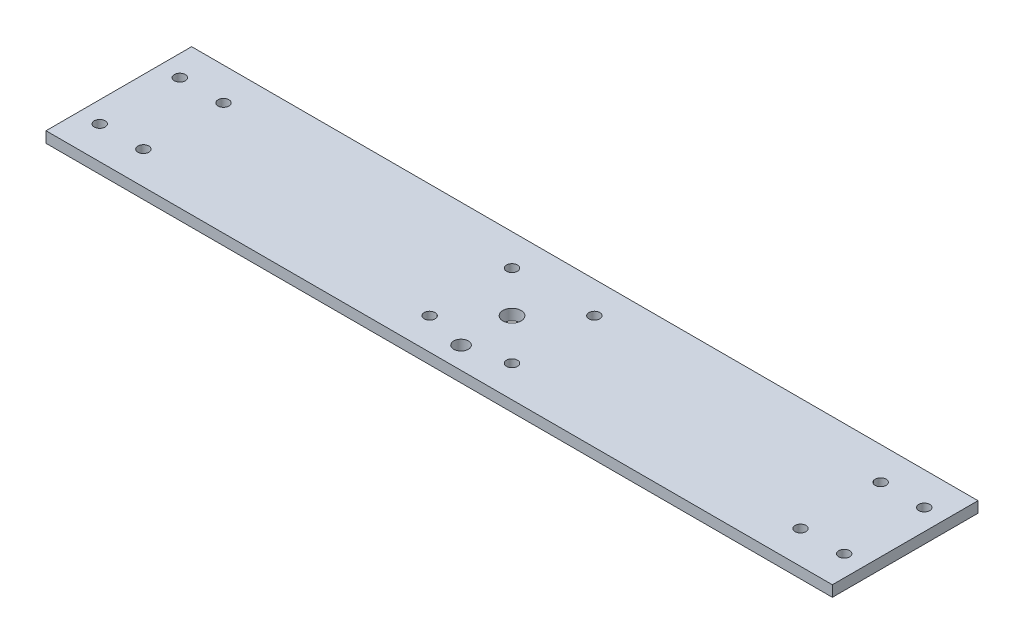
ISO-10303-21;
HEADER;
FILE_DESCRIPTION(('STEP AP214'),'2;1');
FILE_NAME('part.step','',(''),(''),'','','');
FILE_SCHEMA(('AUTOMOTIVE_DESIGN { 1 0 10303 214 1 1 1 1 }'));
ENDSEC;
DATA;
#1=APPLICATION_CONTEXT('core data for automotive mechanical design processes');
#2=APPLICATION_PROTOCOL_DEFINITION('international standard','automotive_design',2000,#1);
#3=PRODUCT_CONTEXT('',#1,'mechanical');
#4=PRODUCT('Part','Part','',(#3));
#5=PRODUCT_RELATED_PRODUCT_CATEGORY('part','',(#4));
#6=PRODUCT_DEFINITION_FORMATION('','',#4);
#7=PRODUCT_DEFINITION_CONTEXT('part definition',#1,'design');
#8=PRODUCT_DEFINITION('design','',#6,#7);
#9=PRODUCT_DEFINITION_SHAPE('','',#8);
#10=(LENGTH_UNIT() NAMED_UNIT(*) SI_UNIT(.MILLI.,.METRE.));
#11=(NAMED_UNIT(*) PLANE_ANGLE_UNIT() SI_UNIT($,.RADIAN.));
#12=(NAMED_UNIT(*) SI_UNIT($,.STERADIAN.) SOLID_ANGLE_UNIT());
#13=UNCERTAINTY_MEASURE_WITH_UNIT(LENGTH_MEASURE(1.E-05),#10,'distance_accuracy_value','');
#14=(GEOMETRIC_REPRESENTATION_CONTEXT(3) GLOBAL_UNCERTAINTY_ASSIGNED_CONTEXT((#13)) GLOBAL_UNIT_ASSIGNED_CONTEXT((#10,
#11,#12)) REPRESENTATION_CONTEXT('',''));
#15=CARTESIAN_POINT('',(0.,0.,0.));
#16=DIRECTION('',(0.,0.,1.));
#17=DIRECTION('',(1.,0.,0.));
#18=AXIS2_PLACEMENT_3D('',#15,#16,#17);
#19=CARTESIAN_POINT('',(0.,0.,0.));
#20=DIRECTION('',(0.,-1.,0.));
#21=DIRECTION('',(0.,0.,-1.));
#22=AXIS2_PLACEMENT_3D('',#19,#20,#21);
#23=PLANE('',#22);
#24=CARTESIAN_POINT('',(90.25,0.,11.));
#25=DIRECTION('',(0.,1.,0.));
#26=DIRECTION('',(0.,0.,1.));
#27=AXIS2_PLACEMENT_3D('',#24,#25,#26);
#28=CIRCLE('',#27,1.5);
#29=CARTESIAN_POINT('',(90.25,0.,12.5));
#30=VERTEX_POINT('',#29);
#31=EDGE_CURVE('E121',#30,#30,#28,.T.);
#32=ORIENTED_EDGE('',*,*,#31,.T.);
#33=EDGE_LOOP('',(#32));
#34=FACE_BOUND('',#33,.T.);
#35=CARTESIAN_POINT('',(90.25,0.,-11.));
#36=DIRECTION('',(0.,1.,0.));
#37=DIRECTION('',(0.,0.,1.));
#38=AXIS2_PLACEMENT_3D('',#35,#36,#37);
#39=CIRCLE('',#38,1.5);
#40=CARTESIAN_POINT('',(90.25,0.,-9.50000000000002));
#41=VERTEX_POINT('',#40);
#42=EDGE_CURVE('E127',#41,#41,#39,.T.);
#43=ORIENTED_EDGE('',*,*,#42,.T.);
#44=EDGE_LOOP('',(#43));
#45=FACE_BOUND('',#44,.T.);
#46=DIRECTION('',(0.,0.,-1.));
#47=VECTOR('',#46,1.);
#48=CARTESIAN_POINT('',(-108.,0.,20.));
#49=LINE('',#48,#47);
#50=CARTESIAN_POINT('',(-108.,0.,20.));
#51=VERTEX_POINT('',#50);
#52=CARTESIAN_POINT('',(-108.,0.,-20.));
#53=VERTEX_POINT('',#52);
#54=EDGE_CURVE('E56',#51,#53,#49,.T.);
#55=ORIENTED_EDGE('',*,*,#54,.T.);
#56=DIRECTION('',(1.,0.,0.));
#57=VECTOR('',#56,1.);
#58=CARTESIAN_POINT('',(-108.,0.,-20.));
#59=LINE('',#58,#57);
#60=CARTESIAN_POINT('',(108.,0.,-20.));
#61=VERTEX_POINT('',#60);
#62=EDGE_CURVE('E452',#53,#61,#59,.T.);
#63=ORIENTED_EDGE('',*,*,#62,.T.);
#64=DIRECTION('',(0.,0.,1.));
#65=VECTOR('',#64,1.);
#66=CARTESIAN_POINT('',(108.,0.,20.));
#67=LINE('',#66,#65);
#68=CARTESIAN_POINT('',(108.,0.,20.));
#69=VERTEX_POINT('',#68);
#70=EDGE_CURVE('E61',#61,#69,#67,.T.);
#71=ORIENTED_EDGE('',*,*,#70,.T.);
#72=DIRECTION('',(-1.,0.,0.));
#73=VECTOR('',#72,1.);
#74=CARTESIAN_POINT('',(-108.,0.,20.));
#75=LINE('',#74,#73);
#76=EDGE_CURVE('E59',#69,#51,#75,.T.);
#77=ORIENTED_EDGE('',*,*,#76,.T.);
#78=EDGE_LOOP('',(#55,#63,#71,#77));
#79=FACE_BOUND('',#78,.T.);
#80=CARTESIAN_POINT('',(-102.25,0.,-11.));
#81=DIRECTION('',(0.,1.,0.));
#82=DIRECTION('',(0.,0.,1.));
#83=AXIS2_PLACEMENT_3D('',#80,#81,#82);
#84=CIRCLE('',#83,1.5);
#85=CARTESIAN_POINT('',(-102.25,0.,-9.50000000000001));
#86=VERTEX_POINT('',#85);
#87=EDGE_CURVE('E67',#86,#86,#84,.T.);
#88=ORIENTED_EDGE('',*,*,#87,.T.);
#89=EDGE_LOOP('',(#88));
#90=FACE_BOUND('',#89,.T.);
#91=CARTESIAN_POINT('',(-90.25,0.,-11.));
#92=DIRECTION('',(0.,1.,0.));
#93=DIRECTION('',(0.,0.,1.));
#94=AXIS2_PLACEMENT_3D('',#91,#92,#93);
#95=CIRCLE('',#94,1.5);
#96=CARTESIAN_POINT('',(-90.25,0.,-9.50000000000002));
#97=VERTEX_POINT('',#96);
#98=EDGE_CURVE('E135',#97,#97,#95,.T.);
#99=ORIENTED_EDGE('',*,*,#98,.T.);
#100=EDGE_LOOP('',(#99));
#101=FACE_BOUND('',#100,.T.);
#102=CARTESIAN_POINT('',(-102.25,0.,11.));
#103=DIRECTION('',(0.,1.,0.));
#104=DIRECTION('',(0.,0.,1.));
#105=AXIS2_PLACEMENT_3D('',#102,#103,#104);
#106=CIRCLE('',#105,1.5);
#107=CARTESIAN_POINT('',(-102.25,0.,12.5));
#108=VERTEX_POINT('',#107);
#109=EDGE_CURVE('E138',#108,#108,#106,.T.);
#110=ORIENTED_EDGE('',*,*,#109,.T.);
#111=EDGE_LOOP('',(#110));
#112=FACE_BOUND('',#111,.T.);
#113=CARTESIAN_POINT('',(-90.25,0.,11.));
#114=DIRECTION('',(0.,1.,0.));
#115=DIRECTION('',(0.,0.,1.));
#116=AXIS2_PLACEMENT_3D('',#113,#114,#115);
#117=CIRCLE('',#116,1.5);
#118=CARTESIAN_POINT('',(-90.25,0.,12.5));
#119=VERTEX_POINT('',#118);
#120=EDGE_CURVE('E141',#119,#119,#117,.T.);
#121=ORIENTED_EDGE('',*,*,#120,.T.);
#122=EDGE_LOOP('',(#121));
#123=FACE_BOUND('',#122,.T.);
#124=CARTESIAN_POINT('',(102.25,0.,-11.));
#125=DIRECTION('',(0.,1.,0.));
#126=DIRECTION('',(0.,0.,1.));
#127=AXIS2_PLACEMENT_3D('',#124,#125,#126);
#128=CIRCLE('',#127,1.5);
#129=CARTESIAN_POINT('',(102.25,0.,-9.50000000000001));
#130=VERTEX_POINT('',#129);
#131=EDGE_CURVE('E130',#130,#130,#128,.T.);
#132=ORIENTED_EDGE('',*,*,#131,.T.);
#133=EDGE_LOOP('',(#132));
#134=FACE_BOUND('',#133,.T.);
#135=CARTESIAN_POINT('',(102.25,0.,11.));
#136=DIRECTION('',(0.,1.,0.));
#137=DIRECTION('',(0.,0.,1.));
#138=AXIS2_PLACEMENT_3D('',#135,#136,#137);
#139=CIRCLE('',#138,1.5);
#140=CARTESIAN_POINT('',(102.25,0.,12.5));
#141=VERTEX_POINT('',#140);
#142=EDGE_CURVE('E124',#141,#141,#139,.T.);
#143=ORIENTED_EDGE('',*,*,#142,.T.);
#144=EDGE_LOOP('',(#143));
#145=FACE_BOUND('',#144,.T.);
#146=CARTESIAN_POINT('',(11.3137084989847,0.,-11.3137084989848));
#147=DIRECTION('',(0.,1.,0.));
#148=DIRECTION('',(0.,0.,1.));
#149=AXIS2_PLACEMENT_3D('',#146,#147,#148);
#150=CIRCLE('',#149,1.5);
#151=CARTESIAN_POINT('',(11.3137084989847,0.,-9.81370849898478));
#152=VERTEX_POINT('',#151);
#153=EDGE_CURVE('E144',#152,#152,#150,.T.);
#154=ORIENTED_EDGE('',*,*,#153,.T.);
#155=EDGE_LOOP('',(#154));
#156=FACE_BOUND('',#155,.T.);
#157=CARTESIAN_POINT('',(11.3137084989849,0.,11.3137084989849));
#158=DIRECTION('',(0.,1.,0.));
#159=DIRECTION('',(0.,0.,1.));
#160=AXIS2_PLACEMENT_3D('',#157,#158,#159);
#161=CIRCLE('',#160,1.49999999999988);
#162=CARTESIAN_POINT('',(11.3137084989849,0.,12.8137084989847));
#163=VERTEX_POINT('',#162);
#164=EDGE_CURVE('E147',#163,#163,#161,.T.);
#165=ORIENTED_EDGE('',*,*,#164,.T.);
#166=EDGE_LOOP('',(#165));
#167=FACE_BOUND('',#166,.T.);
#168=CARTESIAN_POINT('',(-11.3137084989849,0.,11.3137084989849));
#169=DIRECTION('',(0.,1.,0.));
#170=DIRECTION('',(0.,0.,1.));
#171=AXIS2_PLACEMENT_3D('',#168,#169,#170);
#172=CIRCLE('',#171,1.4999999999999);
#173=CARTESIAN_POINT('',(-11.3137084989849,0.,12.8137084989848));
#174=VERTEX_POINT('',#173);
#175=EDGE_CURVE('E150',#174,#174,#172,.T.);
#176=ORIENTED_EDGE('',*,*,#175,.T.);
#177=EDGE_LOOP('',(#176));
#178=FACE_BOUND('',#177,.T.);
#179=CARTESIAN_POINT('',(-11.3137084989849,0.,-11.3137084989849));
#180=DIRECTION('',(0.,1.,0.));
#181=DIRECTION('',(0.,0.,1.));
#182=AXIS2_PLACEMENT_3D('',#179,#180,#181);
#183=CIRCLE('',#182,1.49999999999993);
#184=CARTESIAN_POINT('',(-11.3137084989849,0.,-9.81370849898494));
#185=VERTEX_POINT('',#184);
#186=EDGE_CURVE('E153',#185,#185,#183,.T.);
#187=ORIENTED_EDGE('',*,*,#186,.T.);
#188=EDGE_LOOP('',(#187));
#189=FACE_BOUND('',#188,.T.);
#190=CARTESIAN_POINT('',(0.,0.,0.));
#191=DIRECTION('',(0.,1.,0.));
#192=DIRECTION('',(0.,0.,1.));
#193=AXIS2_PLACEMENT_3D('',#190,#191,#192);
#194=CIRCLE('',#193,2.5);
#195=CARTESIAN_POINT('',(0.,0.,2.5));
#196=VERTEX_POINT('',#195);
#197=EDGE_CURVE('E155',#196,#196,#194,.T.);
#198=ORIENTED_EDGE('',*,*,#197,.T.);
#199=EDGE_LOOP('',(#198));
#200=FACE_BOUND('',#199,.T.);
#201=CARTESIAN_POINT('',(0.,0.,14.));
#202=DIRECTION('',(0.,1.,0.));
#203=DIRECTION('',(0.,0.,1.));
#204=AXIS2_PLACEMENT_3D('',#201,#202,#203);
#205=CIRCLE('',#204,2.);
#206=CARTESIAN_POINT('',(0.,0.,16.));
#207=VERTEX_POINT('',#206);
#208=EDGE_CURVE('E20',#207,#207,#205,.T.);
#209=ORIENTED_EDGE('',*,*,#208,.T.);
#210=EDGE_LOOP('',(#209));
#211=FACE_BOUND('',#210,.T.);
#212=ADVANCED_FACE('F17',(#34,#45,#79,#90,#101,#112,#123,#134,#145,#156,#167,#178,#189,#200,
#211),#23,.T.);
#213=CARTESIAN_POINT('',(0.,-7.,14.));
#214=DIRECTION('',(0.,1.,0.));
#215=DIRECTION('',(0.,0.,1.));
#216=AXIS2_PLACEMENT_3D('',#213,#214,#215);
#217=CYLINDRICAL_SURFACE('',#216,2.);
#218=ORIENTED_EDGE('',*,*,#208,.F.);
#219=EDGE_LOOP('',(#218));
#220=FACE_BOUND('',#219,.T.);
#221=CARTESIAN_POINT('',(0.,3.,14.));
#222=DIRECTION('',(0.,1.,0.));
#223=DIRECTION('',(0.,0.,1.));
#224=AXIS2_PLACEMENT_3D('',#221,#222,#223);
#225=CIRCLE('',#224,2.);
#226=CARTESIAN_POINT('',(0.,3.,16.));
#227=VERTEX_POINT('',#226);
#228=EDGE_CURVE('E118',#227,#227,#225,.T.);
#229=ORIENTED_EDGE('',*,*,#228,.T.);
#230=EDGE_LOOP('',(#229));
#231=FACE_BOUND('',#230,.T.);
#232=ADVANCED_FACE('F163',(#220,#231),#217,.F.);
#233=CARTESIAN_POINT('',(0.,-10.,0.));
#234=DIRECTION('',(0.,1.,0.));
#235=DIRECTION('',(0.,0.,1.));
#236=AXIS2_PLACEMENT_3D('',#233,#234,#235);
#237=CYLINDRICAL_SURFACE('',#236,2.5);
#238=ORIENTED_EDGE('',*,*,#197,.F.);
#239=EDGE_LOOP('',(#238));
#240=FACE_BOUND('',#239,.T.);
#241=CARTESIAN_POINT('',(0.,3.,0.));
#242=DIRECTION('',(0.,1.,0.));
#243=DIRECTION('',(0.,0.,1.));
#244=AXIS2_PLACEMENT_3D('',#241,#242,#243);
#245=CIRCLE('',#244,2.5);
#246=CARTESIAN_POINT('',(0.,3.,2.5));
#247=VERTEX_POINT('',#246);
#248=EDGE_CURVE('E115',#247,#247,#245,.T.);
#249=ORIENTED_EDGE('',*,*,#248,.T.);
#250=EDGE_LOOP('',(#249));
#251=FACE_BOUND('',#250,.T.);
#252=ADVANCED_FACE('F166',(#240,#251),#237,.F.);
#253=CARTESIAN_POINT('',(-11.3137084989849,-27.,-11.3137084989849));
#254=DIRECTION('',(0.,1.,0.));
#255=DIRECTION('',(0.,0.,1.));
#256=AXIS2_PLACEMENT_3D('',#253,#254,#255);
#257=CYLINDRICAL_SURFACE('',#256,1.49999999999993);
#258=ORIENTED_EDGE('',*,*,#186,.F.);
#259=EDGE_LOOP('',(#258));
#260=FACE_BOUND('',#259,.T.);
#261=CARTESIAN_POINT('',(-11.3137084989849,3.,-11.3137084989849));
#262=DIRECTION('',(0.,1.,0.));
#263=DIRECTION('',(0.,0.,1.));
#264=AXIS2_PLACEMENT_3D('',#261,#262,#263);
#265=CIRCLE('',#264,1.49999999999993);
#266=CARTESIAN_POINT('',(-11.3137084989849,3.,-9.81370849898494));
#267=VERTEX_POINT('',#266);
#268=EDGE_CURVE('E112',#267,#267,#265,.T.);
#269=ORIENTED_EDGE('',*,*,#268,.T.);
#270=EDGE_LOOP('',(#269));
#271=FACE_BOUND('',#270,.T.);
#272=ADVANCED_FACE('F233',(#260,#271),#257,.F.);
#273=CARTESIAN_POINT('',(-11.3137084989849,-27.,11.3137084989849));
#274=DIRECTION('',(0.,1.,0.));
#275=DIRECTION('',(0.,0.,1.));
#276=AXIS2_PLACEMENT_3D('',#273,#274,#275);
#277=CYLINDRICAL_SURFACE('',#276,1.4999999999999);
#278=ORIENTED_EDGE('',*,*,#175,.F.);
#279=EDGE_LOOP('',(#278));
#280=FACE_BOUND('',#279,.T.);
#281=CARTESIAN_POINT('',(-11.3137084989849,3.,11.3137084989849));
#282=DIRECTION('',(0.,1.,0.));
#283=DIRECTION('',(0.,0.,1.));
#284=AXIS2_PLACEMENT_3D('',#281,#282,#283);
#285=CIRCLE('',#284,1.4999999999999);
#286=CARTESIAN_POINT('',(-11.3137084989849,3.,12.8137084989848));
#287=VERTEX_POINT('',#286);
#288=EDGE_CURVE('E109',#287,#287,#285,.T.);
#289=ORIENTED_EDGE('',*,*,#288,.T.);
#290=EDGE_LOOP('',(#289));
#291=FACE_BOUND('',#290,.T.);
#292=ADVANCED_FACE('F229',(#280,#291),#277,.F.);
#293=CARTESIAN_POINT('',(11.3137084989849,-27.,11.3137084989849));
#294=DIRECTION('',(0.,1.,0.));
#295=DIRECTION('',(0.,0.,1.));
#296=AXIS2_PLACEMENT_3D('',#293,#294,#295);
#297=CYLINDRICAL_SURFACE('',#296,1.49999999999988);
#298=ORIENTED_EDGE('',*,*,#164,.F.);
#299=EDGE_LOOP('',(#298));
#300=FACE_BOUND('',#299,.T.);
#301=CARTESIAN_POINT('',(11.3137084989849,3.,11.3137084989849));
#302=DIRECTION('',(0.,1.,0.));
#303=DIRECTION('',(0.,0.,1.));
#304=AXIS2_PLACEMENT_3D('',#301,#302,#303);
#305=CIRCLE('',#304,1.49999999999988);
#306=CARTESIAN_POINT('',(11.3137084989849,3.,12.8137084989847));
#307=VERTEX_POINT('',#306);
#308=EDGE_CURVE('E106',#307,#307,#305,.T.);
#309=ORIENTED_EDGE('',*,*,#308,.T.);
#310=EDGE_LOOP('',(#309));
#311=FACE_BOUND('',#310,.T.);
#312=ADVANCED_FACE('F225',(#300,#311),#297,.F.);
#313=CARTESIAN_POINT('',(11.3137084989847,-27.,-11.3137084989848));
#314=DIRECTION('',(0.,1.,0.));
#315=DIRECTION('',(0.,0.,1.));
#316=AXIS2_PLACEMENT_3D('',#313,#314,#315);
#317=CYLINDRICAL_SURFACE('',#316,1.5);
#318=ORIENTED_EDGE('',*,*,#153,.F.);
#319=EDGE_LOOP('',(#318));
#320=FACE_BOUND('',#319,.T.);
#321=CARTESIAN_POINT('',(11.3137084989847,3.,-11.3137084989848));
#322=DIRECTION('',(0.,1.,0.));
#323=DIRECTION('',(0.,0.,1.));
#324=AXIS2_PLACEMENT_3D('',#321,#322,#323);
#325=CIRCLE('',#324,1.5);
#326=CARTESIAN_POINT('',(11.3137084989847,3.,-9.81370849898478));
#327=VERTEX_POINT('',#326);
#328=EDGE_CURVE('E103',#327,#327,#325,.T.);
#329=ORIENTED_EDGE('',*,*,#328,.T.);
#330=EDGE_LOOP('',(#329));
#331=FACE_BOUND('',#330,.T.);
#332=ADVANCED_FACE('F221',(#320,#331),#317,.F.);
#333=CARTESIAN_POINT('',(-90.25,-7.,11.));
#334=DIRECTION('',(0.,1.,0.));
#335=DIRECTION('',(0.,0.,1.));
#336=AXIS2_PLACEMENT_3D('',#333,#334,#335);
#337=CYLINDRICAL_SURFACE('',#336,1.5);
#338=ORIENTED_EDGE('',*,*,#120,.F.);
#339=EDGE_LOOP('',(#338));
#340=FACE_BOUND('',#339,.T.);
#341=CARTESIAN_POINT('',(-90.25,3.,11.));
#342=DIRECTION('',(0.,1.,0.));
#343=DIRECTION('',(0.,0.,1.));
#344=AXIS2_PLACEMENT_3D('',#341,#342,#343);
#345=CIRCLE('',#344,1.5);
#346=CARTESIAN_POINT('',(-90.25,3.,12.5));
#347=VERTEX_POINT('',#346);
#348=EDGE_CURVE('E100',#347,#347,#345,.T.);
#349=ORIENTED_EDGE('',*,*,#348,.T.);
#350=EDGE_LOOP('',(#349));
#351=FACE_BOUND('',#350,.T.);
#352=ADVANCED_FACE('F217',(#340,#351),#337,.F.);
#353=CARTESIAN_POINT('',(-102.25,-7.,11.));
#354=DIRECTION('',(0.,1.,0.));
#355=DIRECTION('',(0.,0.,1.));
#356=AXIS2_PLACEMENT_3D('',#353,#354,#355);
#357=CYLINDRICAL_SURFACE('',#356,1.5);
#358=ORIENTED_EDGE('',*,*,#109,.F.);
#359=EDGE_LOOP('',(#358));
#360=FACE_BOUND('',#359,.T.);
#361=CARTESIAN_POINT('',(-102.25,3.,11.));
#362=DIRECTION('',(0.,1.,0.));
#363=DIRECTION('',(0.,0.,1.));
#364=AXIS2_PLACEMENT_3D('',#361,#362,#363);
#365=CIRCLE('',#364,1.5);
#366=CARTESIAN_POINT('',(-102.25,3.,12.5));
#367=VERTEX_POINT('',#366);
#368=EDGE_CURVE('E97',#367,#367,#365,.T.);
#369=ORIENTED_EDGE('',*,*,#368,.T.);
#370=EDGE_LOOP('',(#369));
#371=FACE_BOUND('',#370,.T.);
#372=ADVANCED_FACE('F213',(#360,#371),#357,.F.);
#373=CARTESIAN_POINT('',(-90.25,-7.,-11.));
#374=DIRECTION('',(0.,1.,0.));
#375=DIRECTION('',(0.,0.,1.));
#376=AXIS2_PLACEMENT_3D('',#373,#374,#375);
#377=CYLINDRICAL_SURFACE('',#376,1.5);
#378=ORIENTED_EDGE('',*,*,#98,.F.);
#379=EDGE_LOOP('',(#378));
#380=FACE_BOUND('',#379,.T.);
#381=CARTESIAN_POINT('',(-90.25,3.,-11.));
#382=DIRECTION('',(0.,1.,0.));
#383=DIRECTION('',(0.,0.,1.));
#384=AXIS2_PLACEMENT_3D('',#381,#382,#383);
#385=CIRCLE('',#384,1.5);
#386=CARTESIAN_POINT('',(-90.25,3.,-9.50000000000002));
#387=VERTEX_POINT('',#386);
#388=EDGE_CURVE('E94',#387,#387,#385,.T.);
#389=ORIENTED_EDGE('',*,*,#388,.T.);
#390=EDGE_LOOP('',(#389));
#391=FACE_BOUND('',#390,.T.);
#392=ADVANCED_FACE('F209',(#380,#391),#377,.F.);
#393=CARTESIAN_POINT('',(-102.25,-7.,-11.));
#394=DIRECTION('',(0.,1.,0.));
#395=DIRECTION('',(0.,0.,1.));
#396=AXIS2_PLACEMENT_3D('',#393,#394,#395);
#397=CYLINDRICAL_SURFACE('',#396,1.5);
#398=ORIENTED_EDGE('',*,*,#87,.F.);
#399=EDGE_LOOP('',(#398));
#400=FACE_BOUND('',#399,.T.);
#401=CARTESIAN_POINT('',(-102.25,3.,-11.));
#402=DIRECTION('',(0.,1.,0.));
#403=DIRECTION('',(0.,0.,1.));
#404=AXIS2_PLACEMENT_3D('',#401,#402,#403);
#405=CIRCLE('',#404,1.5);
#406=CARTESIAN_POINT('',(-102.25,3.,-9.50000000000001));
#407=VERTEX_POINT('',#406);
#408=EDGE_CURVE('E91',#407,#407,#405,.T.);
#409=ORIENTED_EDGE('',*,*,#408,.T.);
#410=EDGE_LOOP('',(#409));
#411=FACE_BOUND('',#410,.T.);
#412=ADVANCED_FACE('F206',(#400,#411),#397,.F.);
#413=CARTESIAN_POINT('',(-108.,3.,20.));
#414=DIRECTION('',(0.,0.,-1.));
#415=DIRECTION('',(-1.,0.,0.));
#416=AXIS2_PLACEMENT_3D('',#413,#414,#415);
#417=PLANE('',#416);
#418=DIRECTION('',(0.,1.,0.));
#419=VECTOR('',#418,1.);
#420=CARTESIAN_POINT('',(108.,3.,20.));
#421=LINE('',#420,#419);
#422=CARTESIAN_POINT('',(108.,3.,20.));
#423=VERTEX_POINT('',#422);
#424=EDGE_CURVE('E462',#69,#423,#421,.T.);
#425=ORIENTED_EDGE('',*,*,#424,.T.);
#426=DIRECTION('',(1.,0.,0.));
#427=VECTOR('',#426,1.);
#428=CARTESIAN_POINT('',(0.,3.,20.));
#429=LINE('',#428,#427);
#430=CARTESIAN_POINT('',(-108.,3.,20.));
#431=VERTEX_POINT('',#430);
#432=EDGE_CURVE('E78',#423,#431,#429,.F.);
#433=ORIENTED_EDGE('',*,*,#432,.T.);
#434=DIRECTION('',(0.,1.,0.));
#435=VECTOR('',#434,1.);
#436=CARTESIAN_POINT('',(-108.,3.,20.));
#437=LINE('',#436,#435);
#438=EDGE_CURVE('E66',#431,#51,#437,.F.);
#439=ORIENTED_EDGE('',*,*,#438,.T.);
#440=ORIENTED_EDGE('',*,*,#76,.F.);
#441=EDGE_LOOP('',(#425,#433,#439,#440));
#442=FACE_BOUND('',#441,.T.);
#443=ADVANCED_FACE('F77',(#442),#417,.F.);
#444=CARTESIAN_POINT('',(-108.,3.,20.));
#445=DIRECTION('',(1.,0.,0.));
#446=DIRECTION('',(0.,0.,-1.));
#447=AXIS2_PLACEMENT_3D('',#444,#445,#446);
#448=PLANE('',#447);
#449=ORIENTED_EDGE('',*,*,#438,.F.);
#450=DIRECTION('',(0.,0.,-1.));
#451=VECTOR('',#450,1.);
#452=CARTESIAN_POINT('',(-108.,3.,0.));
#453=LINE('',#452,#451);
#454=CARTESIAN_POINT('',(-108.,3.,-20.));
#455=VERTEX_POINT('',#454);
#456=EDGE_CURVE('E454',#431,#455,#453,.T.);
#457=ORIENTED_EDGE('',*,*,#456,.T.);
#458=DIRECTION('',(0.,1.,0.));
#459=VECTOR('',#458,1.);
#460=CARTESIAN_POINT('',(-108.,3.,-20.));
#461=LINE('',#460,#459);
#462=EDGE_CURVE('E74',#455,#53,#461,.F.);
#463=ORIENTED_EDGE('',*,*,#462,.T.);
#464=ORIENTED_EDGE('',*,*,#54,.F.);
#465=EDGE_LOOP('',(#449,#457,#463,#464));
#466=FACE_BOUND('',#465,.T.);
#467=ADVANCED_FACE('F71',(#466),#448,.F.);
#468=CARTESIAN_POINT('',(-108.,3.,-20.));
#469=DIRECTION('',(0.,0.,1.));
#470=DIRECTION('',(1.,0.,0.));
#471=AXIS2_PLACEMENT_3D('',#468,#469,#470);
#472=PLANE('',#471);
#473=ORIENTED_EDGE('',*,*,#462,.F.);
#474=DIRECTION('',(1.,0.,0.));
#475=VECTOR('',#474,1.);
#476=CARTESIAN_POINT('',(0.,3.,-20.));
#477=LINE('',#476,#475);
#478=CARTESIAN_POINT('',(108.,3.,-20.));
#479=VERTEX_POINT('',#478);
#480=EDGE_CURVE('E451',#455,#479,#477,.T.);
#481=ORIENTED_EDGE('',*,*,#480,.T.);
#482=DIRECTION('',(0.,1.,0.));
#483=VECTOR('',#482,1.);
#484=CARTESIAN_POINT('',(108.,3.,-20.));
#485=LINE('',#484,#483);
#486=EDGE_CURVE('E35',#479,#61,#485,.F.);
#487=ORIENTED_EDGE('',*,*,#486,.T.);
#488=ORIENTED_EDGE('',*,*,#62,.F.);
#489=EDGE_LOOP('',(#473,#481,#487,#488));
#490=FACE_BOUND('',#489,.T.);
#491=ADVANCED_FACE('F198',(#490),#472,.F.);
#492=CARTESIAN_POINT('',(108.,3.,20.));
#493=DIRECTION('',(-1.,0.,0.));
#494=DIRECTION('',(0.,0.,1.));
#495=AXIS2_PLACEMENT_3D('',#492,#493,#494);
#496=PLANE('',#495);
#497=ORIENTED_EDGE('',*,*,#486,.F.);
#498=DIRECTION('',(0.,0.,-1.));
#499=VECTOR('',#498,1.);
#500=CARTESIAN_POINT('',(108.,3.,0.));
#501=LINE('',#500,#499);
#502=EDGE_CURVE('E90',#479,#423,#501,.F.);
#503=ORIENTED_EDGE('',*,*,#502,.T.);
#504=ORIENTED_EDGE('',*,*,#424,.F.);
#505=ORIENTED_EDGE('',*,*,#70,.F.);
#506=EDGE_LOOP('',(#497,#503,#504,#505));
#507=FACE_BOUND('',#506,.T.);
#508=ADVANCED_FACE('F194',(#507),#496,.F.);
#509=CARTESIAN_POINT('',(102.25,-7.,-11.));
#510=DIRECTION('',(0.,1.,0.));
#511=DIRECTION('',(0.,0.,1.));
#512=AXIS2_PLACEMENT_3D('',#509,#510,#511);
#513=CYLINDRICAL_SURFACE('',#512,1.5);
#514=CARTESIAN_POINT('',(102.25,3.,-11.));
#515=DIRECTION('',(0.,1.,0.));
#516=DIRECTION('',(0.,0.,1.));
#517=AXIS2_PLACEMENT_3D('',#514,#515,#516);
#518=CIRCLE('',#517,1.5);
#519=CARTESIAN_POINT('',(102.25,3.,-9.50000000000001));
#520=VERTEX_POINT('',#519);
#521=EDGE_CURVE('E87',#520,#520,#518,.T.);
#522=ORIENTED_EDGE('',*,*,#521,.T.);
#523=EDGE_LOOP('',(#522));
#524=FACE_BOUND('',#523,.T.);
#525=ORIENTED_EDGE('',*,*,#131,.F.);
#526=EDGE_LOOP('',(#525));
#527=FACE_BOUND('',#526,.T.);
#528=ADVANCED_FACE('F190',(#524,#527),#513,.F.);
#529=CARTESIAN_POINT('',(90.25,-7.,-11.));
#530=DIRECTION('',(0.,1.,0.));
#531=DIRECTION('',(0.,0.,1.));
#532=AXIS2_PLACEMENT_3D('',#529,#530,#531);
#533=CYLINDRICAL_SURFACE('',#532,1.5);
#534=CARTESIAN_POINT('',(90.25,3.,-11.));
#535=DIRECTION('',(0.,1.,0.));
#536=DIRECTION('',(0.,0.,1.));
#537=AXIS2_PLACEMENT_3D('',#534,#535,#536);
#538=CIRCLE('',#537,1.5);
#539=CARTESIAN_POINT('',(90.25,3.,-9.50000000000002));
#540=VERTEX_POINT('',#539);
#541=EDGE_CURVE('E84',#540,#540,#538,.T.);
#542=ORIENTED_EDGE('',*,*,#541,.T.);
#543=EDGE_LOOP('',(#542));
#544=FACE_BOUND('',#543,.T.);
#545=ORIENTED_EDGE('',*,*,#42,.F.);
#546=EDGE_LOOP('',(#545));
#547=FACE_BOUND('',#546,.T.);
#548=ADVANCED_FACE('F186',(#544,#547),#533,.F.);
#549=CARTESIAN_POINT('',(102.25,-7.,11.));
#550=DIRECTION('',(0.,1.,0.));
#551=DIRECTION('',(0.,0.,1.));
#552=AXIS2_PLACEMENT_3D('',#549,#550,#551);
#553=CYLINDRICAL_SURFACE('',#552,1.5);
#554=CARTESIAN_POINT('',(102.25,3.,11.));
#555=DIRECTION('',(0.,1.,0.));
#556=DIRECTION('',(0.,0.,1.));
#557=AXIS2_PLACEMENT_3D('',#554,#555,#556);
#558=CIRCLE('',#557,1.5);
#559=CARTESIAN_POINT('',(102.25,3.,12.5));
#560=VERTEX_POINT('',#559);
#561=EDGE_CURVE('E26',#560,#560,#558,.T.);
#562=ORIENTED_EDGE('',*,*,#561,.T.);
#563=EDGE_LOOP('',(#562));
#564=FACE_BOUND('',#563,.T.);
#565=ORIENTED_EDGE('',*,*,#142,.F.);
#566=EDGE_LOOP('',(#565));
#567=FACE_BOUND('',#566,.T.);
#568=ADVANCED_FACE('F178',(#564,#567),#553,.F.);
#569=CARTESIAN_POINT('',(90.25,-7.,11.));
#570=DIRECTION('',(0.,1.,0.));
#571=DIRECTION('',(0.,0.,1.));
#572=AXIS2_PLACEMENT_3D('',#569,#570,#571);
#573=CYLINDRICAL_SURFACE('',#572,1.5);
#574=CARTESIAN_POINT('',(90.25,3.,11.));
#575=DIRECTION('',(0.,1.,0.));
#576=DIRECTION('',(0.,0.,1.));
#577=AXIS2_PLACEMENT_3D('',#574,#575,#576);
#578=CIRCLE('',#577,1.5);
#579=CARTESIAN_POINT('',(90.25,3.,12.5));
#580=VERTEX_POINT('',#579);
#581=EDGE_CURVE('E11',#580,#580,#578,.T.);
#582=ORIENTED_EDGE('',*,*,#581,.T.);
#583=EDGE_LOOP('',(#582));
#584=FACE_BOUND('',#583,.T.);
#585=ORIENTED_EDGE('',*,*,#31,.F.);
#586=EDGE_LOOP('',(#585));
#587=FACE_BOUND('',#586,.T.);
#588=ADVANCED_FACE('F171',(#584,#587),#573,.F.);
#589=CARTESIAN_POINT('',(0.,3.,0.));
#590=DIRECTION('',(0.,-1.,0.));
#591=DIRECTION('',(0.,0.,-1.));
#592=AXIS2_PLACEMENT_3D('',#589,#590,#591);
#593=PLANE('',#592);
#594=ORIENTED_EDGE('',*,*,#581,.F.);
#595=EDGE_LOOP('',(#594));
#596=FACE_BOUND('',#595,.T.);
#597=ORIENTED_EDGE('',*,*,#561,.F.);
#598=EDGE_LOOP('',(#597));
#599=FACE_BOUND('',#598,.T.);
#600=ORIENTED_EDGE('',*,*,#541,.F.);
#601=EDGE_LOOP('',(#600));
#602=FACE_BOUND('',#601,.T.);
#603=ORIENTED_EDGE('',*,*,#521,.F.);
#604=EDGE_LOOP('',(#603));
#605=FACE_BOUND('',#604,.T.);
#606=ORIENTED_EDGE('',*,*,#480,.F.);
#607=ORIENTED_EDGE('',*,*,#456,.F.);
#608=ORIENTED_EDGE('',*,*,#432,.F.);
#609=ORIENTED_EDGE('',*,*,#502,.F.);
#610=EDGE_LOOP('',(#606,#607,#608,#609));
#611=FACE_BOUND('',#610,.T.);
#612=ORIENTED_EDGE('',*,*,#408,.F.);
#613=EDGE_LOOP('',(#612));
#614=FACE_BOUND('',#613,.T.);
#615=ORIENTED_EDGE('',*,*,#388,.F.);
#616=EDGE_LOOP('',(#615));
#617=FACE_BOUND('',#616,.T.);
#618=ORIENTED_EDGE('',*,*,#368,.F.);
#619=EDGE_LOOP('',(#618));
#620=FACE_BOUND('',#619,.T.);
#621=ORIENTED_EDGE('',*,*,#348,.F.);
#622=EDGE_LOOP('',(#621));
#623=FACE_BOUND('',#622,.T.);
#624=ORIENTED_EDGE('',*,*,#328,.F.);
#625=EDGE_LOOP('',(#624));
#626=FACE_BOUND('',#625,.T.);
#627=ORIENTED_EDGE('',*,*,#308,.F.);
#628=EDGE_LOOP('',(#627));
#629=FACE_BOUND('',#628,.T.);
#630=ORIENTED_EDGE('',*,*,#288,.F.);
#631=EDGE_LOOP('',(#630));
#632=FACE_BOUND('',#631,.T.);
#633=ORIENTED_EDGE('',*,*,#268,.F.);
#634=EDGE_LOOP('',(#633));
#635=FACE_BOUND('',#634,.T.);
#636=ORIENTED_EDGE('',*,*,#248,.F.);
#637=EDGE_LOOP('',(#636));
#638=FACE_BOUND('',#637,.T.);
#639=ORIENTED_EDGE('',*,*,#228,.F.);
#640=EDGE_LOOP('',(#639));
#641=FACE_BOUND('',#640,.T.);
#642=ADVANCED_FACE('F169',(#596,#599,#602,#605,#611,#614,#617,#620,#623,#626,#629,#632,#635,
#638,#641),#593,.F.);
#643=CLOSED_SHELL('',(#212,#232,#252,#272,#292,#312,#332,#352,#372,#392,#412,#443,#467,#491,
#508,#528,#548,#568,#588,#642));
#644=MANIFOLD_SOLID_BREP('B1',#643);
#645=ADVANCED_BREP_SHAPE_REPRESENTATION('',(#18,#644),#14);
#646=SHAPE_DEFINITION_REPRESENTATION(#9,#645);
ENDSEC;
END-ISO-10303-21;
